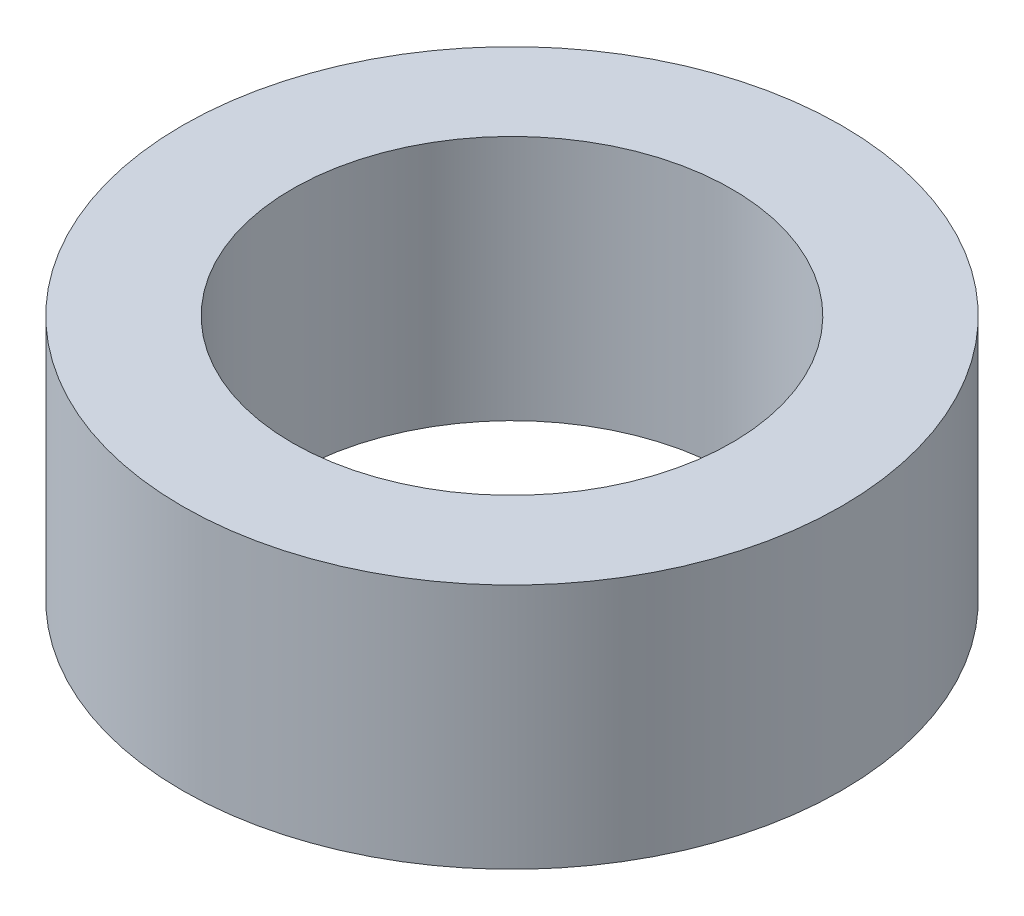
ISO-10303-21;
HEADER;
FILE_DESCRIPTION(('STEP AP214'),'2;1');
FILE_NAME('part.step','',(''),(''),'','','');
FILE_SCHEMA(('AUTOMOTIVE_DESIGN { 1 0 10303 214 1 1 1 1 }'));
ENDSEC;
DATA;
#1=APPLICATION_CONTEXT('core data for automotive mechanical design processes');
#2=APPLICATION_PROTOCOL_DEFINITION('international standard','automotive_design',2000,#1);
#3=PRODUCT_CONTEXT('',#1,'mechanical');
#4=PRODUCT('Part','Part','',(#3));
#5=PRODUCT_RELATED_PRODUCT_CATEGORY('part','',(#4));
#6=PRODUCT_DEFINITION_FORMATION('','',#4);
#7=PRODUCT_DEFINITION_CONTEXT('part definition',#1,'design');
#8=PRODUCT_DEFINITION('design','',#6,#7);
#9=PRODUCT_DEFINITION_SHAPE('','',#8);
#10=(LENGTH_UNIT() NAMED_UNIT(*) SI_UNIT(.MILLI.,.METRE.));
#11=(NAMED_UNIT(*) PLANE_ANGLE_UNIT() SI_UNIT($,.RADIAN.));
#12=(NAMED_UNIT(*) SI_UNIT($,.STERADIAN.) SOLID_ANGLE_UNIT());
#13=UNCERTAINTY_MEASURE_WITH_UNIT(LENGTH_MEASURE(1.E-05),#10,'distance_accuracy_value','');
#14=(GEOMETRIC_REPRESENTATION_CONTEXT(3) GLOBAL_UNCERTAINTY_ASSIGNED_CONTEXT((#13)) GLOBAL_UNIT_ASSIGNED_CONTEXT((#10,
#11,#12)) REPRESENTATION_CONTEXT('',''));
#15=CARTESIAN_POINT('',(0.,0.,0.));
#16=DIRECTION('',(0.,0.,1.));
#17=DIRECTION('',(1.,0.,0.));
#18=AXIS2_PLACEMENT_3D('',#15,#16,#17);
#19=CARTESIAN_POINT('',(0.,7.112,0.));
#20=DIRECTION('',(0.,1.,0.));
#21=DIRECTION('',(0.,0.,1.));
#22=AXIS2_PLACEMENT_3D('',#19,#20,#21);
#23=PLANE('',#22);
#24=CARTESIAN_POINT('',(0.,7.112,0.));
#25=DIRECTION('',(0.,1.,0.));
#26=DIRECTION('',(0.,0.,1.));
#27=AXIS2_PLACEMENT_3D('',#24,#25,#26);
#28=CIRCLE('',#27,9.525);
#29=CARTESIAN_POINT('',(0.,7.112,9.525));
#30=VERTEX_POINT('',#29);
#31=EDGE_CURVE('E10',#30,#30,#28,.T.);
#32=ORIENTED_EDGE('',*,*,#31,.T.);
#33=EDGE_LOOP('',(#32));
#34=FACE_BOUND('',#33,.T.);
#35=CARTESIAN_POINT('',(0.,7.112,0.));
#36=DIRECTION('',(0.,1.,0.));
#37=DIRECTION('',(0.,0.,1.));
#38=AXIS2_PLACEMENT_3D('',#35,#36,#37);
#39=CIRCLE('',#38,6.35);
#40=CARTESIAN_POINT('',(0.,7.112,6.35));
#41=VERTEX_POINT('',#40);
#42=EDGE_CURVE('E42',#41,#41,#39,.T.);
#43=ORIENTED_EDGE('',*,*,#42,.F.);
#44=EDGE_LOOP('',(#43));
#45=FACE_BOUND('',#44,.T.);
#46=ADVANCED_FACE('F31',(#34,#45),#23,.T.);
#47=CARTESIAN_POINT('',(0.,0.,0.));
#48=DIRECTION('',(0.,1.,0.));
#49=DIRECTION('',(0.,0.,1.));
#50=AXIS2_PLACEMENT_3D('',#47,#48,#49);
#51=PLANE('',#50);
#52=CARTESIAN_POINT('',(0.,0.,0.));
#53=DIRECTION('',(0.,1.,0.));
#54=DIRECTION('',(0.,0.,1.));
#55=AXIS2_PLACEMENT_3D('',#52,#53,#54);
#56=CIRCLE('',#55,9.525);
#57=CARTESIAN_POINT('',(0.,0.,9.525));
#58=VERTEX_POINT('',#57);
#59=EDGE_CURVE('E35',#58,#58,#56,.T.);
#60=ORIENTED_EDGE('',*,*,#59,.F.);
#61=EDGE_LOOP('',(#60));
#62=FACE_BOUND('',#61,.T.);
#63=CARTESIAN_POINT('',(0.,0.,0.));
#64=DIRECTION('',(0.,1.,0.));
#65=DIRECTION('',(0.,0.,1.));
#66=AXIS2_PLACEMENT_3D('',#63,#64,#65);
#67=CIRCLE('',#66,6.35);
#68=CARTESIAN_POINT('',(0.,0.,6.35));
#69=VERTEX_POINT('',#68);
#70=EDGE_CURVE('E44',#69,#69,#67,.T.);
#71=ORIENTED_EDGE('',*,*,#70,.T.);
#72=EDGE_LOOP('',(#71));
#73=FACE_BOUND('',#72,.T.);
#74=ADVANCED_FACE('F54',(#62,#73),#51,.F.);
#75=CARTESIAN_POINT('',(0.,7.112,0.));
#76=DIRECTION('',(0.,-1.,0.));
#77=DIRECTION('',(0.,0.,-1.));
#78=AXIS2_PLACEMENT_3D('',#75,#76,#77);
#79=CYLINDRICAL_SURFACE('',#78,9.525);
#80=ORIENTED_EDGE('',*,*,#31,.F.);
#81=EDGE_LOOP('',(#80));
#82=FACE_BOUND('',#81,.T.);
#83=ORIENTED_EDGE('',*,*,#59,.T.);
#84=EDGE_LOOP('',(#83));
#85=FACE_BOUND('',#84,.T.);
#86=ADVANCED_FACE('F33',(#82,#85),#79,.T.);
#87=CARTESIAN_POINT('',(0.,7.112,0.));
#88=DIRECTION('',(0.,-1.,0.));
#89=DIRECTION('',(0.,0.,-1.));
#90=AXIS2_PLACEMENT_3D('',#87,#88,#89);
#91=CYLINDRICAL_SURFACE('',#90,6.35);
#92=ORIENTED_EDGE('',*,*,#42,.T.);
#93=EDGE_LOOP('',(#92));
#94=FACE_BOUND('',#93,.T.);
#95=ORIENTED_EDGE('',*,*,#70,.F.);
#96=EDGE_LOOP('',(#95));
#97=FACE_BOUND('',#96,.T.);
#98=ADVANCED_FACE('F50',(#94,#97),#91,.F.);
#99=CLOSED_SHELL('',(#46,#74,#86,#98));
#100=MANIFOLD_SOLID_BREP('B2',#99);
#101=ADVANCED_BREP_SHAPE_REPRESENTATION('',(#18,#100),#14);
#102=SHAPE_DEFINITION_REPRESENTATION(#9,#101);
ENDSEC;
END-ISO-10303-21;
